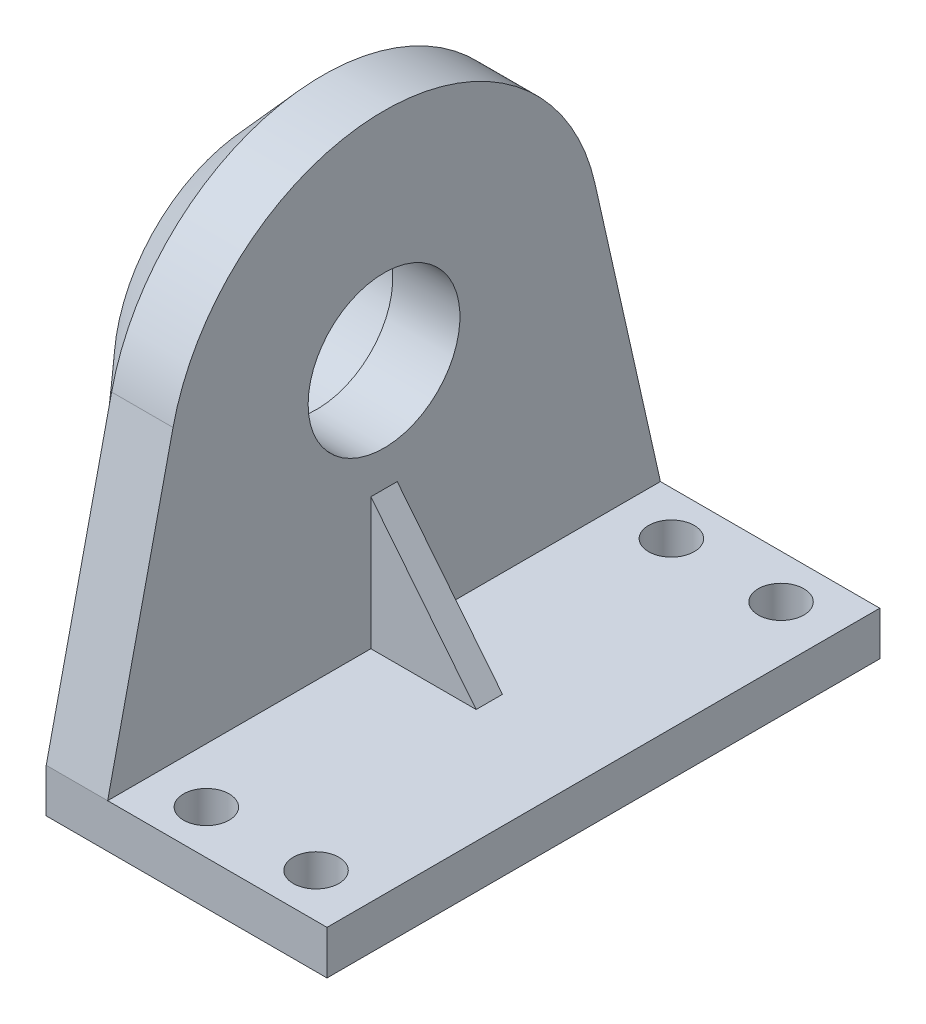
ISO-10303-21;
HEADER;
FILE_DESCRIPTION(('STEP AP214'),'2;1');
FILE_NAME('part.step','',(''),(''),'','','');
FILE_SCHEMA(('AUTOMOTIVE_DESIGN { 1 0 10303 214 1 1 1 1 }'));
ENDSEC;
DATA;
#1=APPLICATION_CONTEXT('core data for automotive mechanical design processes');
#2=APPLICATION_PROTOCOL_DEFINITION('international standard','automotive_design',2000,#1);
#3=PRODUCT_CONTEXT('',#1,'mechanical');
#4=PRODUCT('Part','Part','',(#3));
#5=PRODUCT_RELATED_PRODUCT_CATEGORY('part','',(#4));
#6=PRODUCT_DEFINITION_FORMATION('','',#4);
#7=PRODUCT_DEFINITION_CONTEXT('part definition',#1,'design');
#8=PRODUCT_DEFINITION('design','',#6,#7);
#9=PRODUCT_DEFINITION_SHAPE('','',#8);
#10=(LENGTH_UNIT() NAMED_UNIT(*) SI_UNIT(.MILLI.,.METRE.));
#11=(NAMED_UNIT(*) PLANE_ANGLE_UNIT() SI_UNIT($,.RADIAN.));
#12=(NAMED_UNIT(*) SI_UNIT($,.STERADIAN.) SOLID_ANGLE_UNIT());
#13=UNCERTAINTY_MEASURE_WITH_UNIT(LENGTH_MEASURE(1.E-05),#10,'distance_accuracy_value','');
#14=(GEOMETRIC_REPRESENTATION_CONTEXT(3) GLOBAL_UNCERTAINTY_ASSIGNED_CONTEXT((#13)) GLOBAL_UNIT_ASSIGNED_CONTEXT((#10,
#11,#12)) REPRESENTATION_CONTEXT('',''));
#15=CARTESIAN_POINT('',(0.,0.,0.));
#16=DIRECTION('',(0.,0.,1.));
#17=DIRECTION('',(1.,0.,0.));
#18=AXIS2_PLACEMENT_3D('',#15,#16,#17);
#19=CARTESIAN_POINT('',(14.6534343765315,24.65,0.));
#20=DIRECTION('',(-1.,0.,0.));
#21=DIRECTION('',(0.,0.,1.));
#22=AXIS2_PLACEMENT_3D('',#19,#20,#21);
#23=PLANE('',#22);
#24=CARTESIAN_POINT('',(14.6534343765315,0.,0.));
#25=DIRECTION('',(-1.,0.,0.));
#26=DIRECTION('',(0.,0.,1.));
#27=AXIS2_PLACEMENT_3D('',#24,#25,#26);
#28=CIRCLE('',#27,8.65);
#29=CARTESIAN_POINT('',(14.6534343765315,0.,8.65));
#30=VERTEX_POINT('',#29);
#31=EDGE_CURVE('E272',#30,#30,#28,.T.);
#32=ORIENTED_EDGE('',*,*,#31,.T.);
#33=EDGE_LOOP('',(#32));
#34=FACE_BOUND('',#33,.T.);
#35=DIRECTION('',(0.,-1.,0.));
#36=VECTOR('',#35,1.);
#37=CARTESIAN_POINT('',(14.6534343765316,-27.7,1.5));
#38=LINE('',#37,#36);
#39=CARTESIAN_POINT('',(14.6534343765316,-12.7,1.5));
#40=VERTEX_POINT('',#39);
#41=CARTESIAN_POINT('',(14.6534343765316,-27.7,1.5));
#42=VERTEX_POINT('',#41);
#43=EDGE_CURVE('E130',#40,#42,#38,.T.);
#44=ORIENTED_EDGE('',*,*,#43,.F.);
#45=DIRECTION('',(0.,0.,-1.));
#46=VECTOR('',#45,1.);
#47=CARTESIAN_POINT('',(14.6534343765316,-12.7,1.5));
#48=LINE('',#47,#46);
#49=CARTESIAN_POINT('',(14.6534343765316,-12.7,-1.5));
#50=VERTEX_POINT('',#49);
#51=EDGE_CURVE('E126',#40,#50,#48,.T.);
#52=ORIENTED_EDGE('',*,*,#51,.T.);
#53=DIRECTION('',(0.,-1.,0.));
#54=VECTOR('',#53,1.);
#55=CARTESIAN_POINT('',(14.6534343765316,-27.7,-1.5));
#56=LINE('',#55,#54);
#57=CARTESIAN_POINT('',(14.6534343765316,-27.7,-1.5));
#58=VERTEX_POINT('',#57);
#59=EDGE_CURVE('E138',#50,#58,#56,.T.);
#60=ORIENTED_EDGE('',*,*,#59,.T.);
#61=DIRECTION('',(0.,0.,1.));
#62=VECTOR('',#61,1.);
#63=CARTESIAN_POINT('',(14.6534343765315,-27.7,-31.5));
#64=LINE('',#63,#62);
#65=CARTESIAN_POINT('',(14.6534343765315,-27.7,-31.5));
#66=VERTEX_POINT('',#65);
#67=EDGE_CURVE('E188',#66,#58,#64,.T.);
#68=ORIENTED_EDGE('',*,*,#67,.F.);
#69=DIRECTION('',(0.,0.975601867960363,0.219547250568643));
#70=VECTOR('',#69,1.);
#71=CARTESIAN_POINT('',(14.6534343765315,-27.7,-31.5));
#72=LINE('',#71,#70);
#73=CARTESIAN_POINT('',(14.6534343765315,5.41183972651707,-24.048586045223));
#74=VERTEX_POINT('',#73);
#75=EDGE_CURVE('E214',#66,#74,#72,.T.);
#76=ORIENTED_EDGE('',*,*,#75,.T.);
#77=CARTESIAN_POINT('',(14.6534343765315,0.,0.));
#78=DIRECTION('',(-1.,0.,0.));
#79=DIRECTION('',(0.,0.,1.));
#80=AXIS2_PLACEMENT_3D('',#77,#78,#79);
#81=CIRCLE('',#80,24.65);
#82=CARTESIAN_POINT('',(14.6534343765315,5.41183972651706,24.048586045223));
#83=VERTEX_POINT('',#82);
#84=EDGE_CURVE('E268',#83,#74,#81,.T.);
#85=ORIENTED_EDGE('',*,*,#84,.F.);
#86=DIRECTION('',(0.,-0.975601867960363,0.219547250568643));
#87=VECTOR('',#86,1.);
#88=CARTESIAN_POINT('',(14.6534343765315,-27.7,31.5));
#89=LINE('',#88,#87);
#90=CARTESIAN_POINT('',(14.6534343765315,-27.7,31.5));
#91=VERTEX_POINT('',#90);
#92=EDGE_CURVE('E209',#83,#91,#89,.T.);
#93=ORIENTED_EDGE('',*,*,#92,.T.);
#94=EDGE_CURVE('E179',#42,#91,#64,.T.);
#95=ORIENTED_EDGE('',*,*,#94,.F.);
#96=EDGE_LOOP('',(#44,#52,#60,#68,#76,#85,#93,#95));
#97=FACE_BOUND('',#96,.T.);
#98=ADVANCED_FACE('F45',(#34,#97),#23,.F.);
#99=CARTESIAN_POINT('',(39.6534343765315,-27.7,-31.5));
#100=DIRECTION('',(0.,-1.,0.));
#101=DIRECTION('',(0.,0.,-1.));
#102=AXIS2_PLACEMENT_3D('',#99,#100,#101);
#103=PLANE('',#102);
#104=CARTESIAN_POINT('',(20.9034343765316,-27.7,-26.5));
#105=DIRECTION('',(0.,1.,0.));
#106=DIRECTION('',(0.,0.,1.));
#107=AXIS2_PLACEMENT_3D('',#104,#105,#106);
#108=CIRCLE('',#107,2.6);
#109=CARTESIAN_POINT('',(20.9034343765316,-27.7,-23.9));
#110=VERTEX_POINT('',#109);
#111=EDGE_CURVE('E159',#110,#110,#108,.T.);
#112=ORIENTED_EDGE('',*,*,#111,.F.);
#113=EDGE_LOOP('',(#112));
#114=FACE_BOUND('',#113,.T.);
#115=CARTESIAN_POINT('',(33.4034343765315,-27.7,-26.5));
#116=DIRECTION('',(0.,1.,0.));
#117=DIRECTION('',(0.,0.,1.));
#118=AXIS2_PLACEMENT_3D('',#115,#116,#117);
#119=CIRCLE('',#118,2.6);
#120=CARTESIAN_POINT('',(33.4034343765315,-27.7,-23.9));
#121=VERTEX_POINT('',#120);
#122=EDGE_CURVE('E155',#121,#121,#119,.T.);
#123=ORIENTED_EDGE('',*,*,#122,.F.);
#124=EDGE_LOOP('',(#123));
#125=FACE_BOUND('',#124,.T.);
#126=CARTESIAN_POINT('',(33.4034343765315,-27.7,26.5));
#127=DIRECTION('',(0.,1.,0.));
#128=DIRECTION('',(0.,0.,1.));
#129=AXIS2_PLACEMENT_3D('',#126,#127,#128);
#130=CIRCLE('',#129,2.6);
#131=CARTESIAN_POINT('',(33.4034343765315,-27.7,29.1));
#132=VERTEX_POINT('',#131);
#133=EDGE_CURVE('E164',#132,#132,#130,.T.);
#134=ORIENTED_EDGE('',*,*,#133,.F.);
#135=EDGE_LOOP('',(#134));
#136=FACE_BOUND('',#135,.T.);
#137=CARTESIAN_POINT('',(20.9034343765316,-27.7,26.5));
#138=DIRECTION('',(0.,1.,0.));
#139=DIRECTION('',(0.,0.,1.));
#140=AXIS2_PLACEMENT_3D('',#137,#138,#139);
#141=CIRCLE('',#140,2.6);
#142=CARTESIAN_POINT('',(20.9034343765316,-27.7,29.1));
#143=VERTEX_POINT('',#142);
#144=EDGE_CURVE('E150',#143,#143,#141,.T.);
#145=ORIENTED_EDGE('',*,*,#144,.F.);
#146=EDGE_LOOP('',(#145));
#147=FACE_BOUND('',#146,.T.);
#148=DIRECTION('',(1.,0.,0.));
#149=VECTOR('',#148,1.);
#150=CARTESIAN_POINT('',(26.6534343765316,-27.7,1.5));
#151=LINE('',#150,#149);
#152=CARTESIAN_POINT('',(26.6534343765316,-27.7,1.5));
#153=VERTEX_POINT('',#152);
#154=EDGE_CURVE('E131',#42,#153,#151,.T.);
#155=ORIENTED_EDGE('',*,*,#154,.F.);
#156=ORIENTED_EDGE('',*,*,#94,.T.);
#157=DIRECTION('',(-1.,0.,0.));
#158=VECTOR('',#157,1.);
#159=CARTESIAN_POINT('',(39.6534343765315,-27.7,31.5));
#160=LINE('',#159,#158);
#161=CARTESIAN_POINT('',(39.6534343765315,-27.7,31.5));
#162=VERTEX_POINT('',#161);
#163=EDGE_CURVE('E199',#162,#91,#160,.T.);
#164=ORIENTED_EDGE('',*,*,#163,.F.);
#165=DIRECTION('',(0.,0.,1.));
#166=VECTOR('',#165,1.);
#167=CARTESIAN_POINT('',(39.6534343765315,-27.7,-31.5));
#168=LINE('',#167,#166);
#169=CARTESIAN_POINT('',(39.6534343765315,-27.7,-31.5));
#170=VERTEX_POINT('',#169);
#171=EDGE_CURVE('E187',#170,#162,#168,.T.);
#172=ORIENTED_EDGE('',*,*,#171,.F.);
#173=DIRECTION('',(-1.,0.,0.));
#174=VECTOR('',#173,1.);
#175=CARTESIAN_POINT('',(39.6534343765315,-27.7,-31.5));
#176=LINE('',#175,#174);
#177=EDGE_CURVE('E205',#170,#66,#176,.T.);
#178=ORIENTED_EDGE('',*,*,#177,.T.);
#179=ORIENTED_EDGE('',*,*,#67,.T.);
#180=DIRECTION('',(1.,0.,0.));
#181=VECTOR('',#180,1.);
#182=CARTESIAN_POINT('',(26.6534343765316,-27.7,-1.5));
#183=LINE('',#182,#181);
#184=CARTESIAN_POINT('',(26.6534343765316,-27.7,-1.5));
#185=VERTEX_POINT('',#184);
#186=EDGE_CURVE('E143',#58,#185,#183,.T.);
#187=ORIENTED_EDGE('',*,*,#186,.T.);
#188=DIRECTION('',(0.,0.,-1.));
#189=VECTOR('',#188,1.);
#190=CARTESIAN_POINT('',(26.6534343765316,-27.7,1.5));
#191=LINE('',#190,#189);
#192=EDGE_CURVE('E61',#153,#185,#191,.T.);
#193=ORIENTED_EDGE('',*,*,#192,.F.);
#194=EDGE_LOOP('',(#155,#156,#164,#172,#178,#179,#187,#193));
#195=FACE_BOUND('',#194,.T.);
#196=ADVANCED_FACE('F141',(#114,#125,#136,#147,#195),#103,.F.);
#197=CARTESIAN_POINT('',(0.,11.15,0.));
#198=DIRECTION('',(1.,0.,0.));
#199=DIRECTION('',(0.,0.,-1.));
#200=AXIS2_PLACEMENT_3D('',#197,#198,#199);
#201=PLANE('',#200);
#202=CARTESIAN_POINT('',(0.,0.,0.));
#203=DIRECTION('',(-1.,0.,0.));
#204=DIRECTION('',(0.,0.,1.));
#205=AXIS2_PLACEMENT_3D('',#202,#203,#204);
#206=CIRCLE('',#205,11.15);
#207=CARTESIAN_POINT('',(0.,0.,11.15));
#208=VERTEX_POINT('',#207);
#209=EDGE_CURVE('E11',#208,#208,#206,.T.);
#210=ORIENTED_EDGE('',*,*,#209,.F.);
#211=EDGE_LOOP('',(#210));
#212=FACE_BOUND('',#211,.T.);
#213=CARTESIAN_POINT('',(0.,0.,0.));
#214=DIRECTION('',(-1.,0.,0.));
#215=DIRECTION('',(0.,0.,1.));
#216=AXIS2_PLACEMENT_3D('',#213,#214,#215);
#217=CIRCLE('',#216,16.15);
#218=CARTESIAN_POINT('',(0.,0.,16.15));
#219=VERTEX_POINT('',#218);
#220=EDGE_CURVE('E243',#219,#219,#217,.T.);
#221=ORIENTED_EDGE('',*,*,#220,.T.);
#222=EDGE_LOOP('',(#221));
#223=FACE_BOUND('',#222,.T.);
#224=ADVANCED_FACE('F47',(#212,#223),#201,.F.);
#225=CARTESIAN_POINT('',(0.,0.,0.));
#226=DIRECTION('',(-1.,0.,0.));
#227=DIRECTION('',(0.,0.,1.));
#228=AXIS2_PLACEMENT_3D('',#225,#226,#227);
#229=CYLINDRICAL_SURFACE('',#228,11.15);
#230=CARTESIAN_POINT('',(7.,0.,0.));
#231=DIRECTION('',(-1.,0.,0.));
#232=DIRECTION('',(0.,0.,1.));
#233=AXIS2_PLACEMENT_3D('',#230,#231,#232);
#234=CIRCLE('',#233,11.15);
#235=CARTESIAN_POINT('',(7.,0.,11.15));
#236=VERTEX_POINT('',#235);
#237=EDGE_CURVE('E54',#236,#236,#234,.T.);
#238=ORIENTED_EDGE('',*,*,#237,.F.);
#239=EDGE_LOOP('',(#238));
#240=FACE_BOUND('',#239,.T.);
#241=ORIENTED_EDGE('',*,*,#209,.T.);
#242=EDGE_LOOP('',(#241));
#243=FACE_BOUND('',#242,.T.);
#244=ADVANCED_FACE('F285',(#240,#243),#229,.F.);
#245=CARTESIAN_POINT('',(7.,11.15,0.));
#246=DIRECTION('',(1.,0.,0.));
#247=DIRECTION('',(0.,0.,-1.));
#248=AXIS2_PLACEMENT_3D('',#245,#246,#247);
#249=PLANE('',#248);
#250=CARTESIAN_POINT('',(7.,0.,0.));
#251=DIRECTION('',(-1.,0.,0.));
#252=DIRECTION('',(0.,0.,1.));
#253=AXIS2_PLACEMENT_3D('',#250,#251,#252);
#254=CIRCLE('',#253,8.65);
#255=CARTESIAN_POINT('',(7.,0.,8.65));
#256=VERTEX_POINT('',#255);
#257=EDGE_CURVE('E276',#256,#256,#254,.T.);
#258=ORIENTED_EDGE('',*,*,#257,.F.);
#259=EDGE_LOOP('',(#258));
#260=FACE_BOUND('',#259,.T.);
#261=ORIENTED_EDGE('',*,*,#237,.T.);
#262=EDGE_LOOP('',(#261));
#263=FACE_BOUND('',#262,.T.);
#264=ADVANCED_FACE('F283',(#260,#263),#249,.F.);
#265=CARTESIAN_POINT('',(0.,0.,0.));
#266=DIRECTION('',(-1.,0.,0.));
#267=DIRECTION('',(0.,0.,1.));
#268=AXIS2_PLACEMENT_3D('',#265,#266,#267);
#269=CYLINDRICAL_SURFACE('',#268,8.65);
#270=ORIENTED_EDGE('',*,*,#31,.F.);
#271=EDGE_LOOP('',(#270));
#272=FACE_BOUND('',#271,.T.);
#273=ORIENTED_EDGE('',*,*,#257,.T.);
#274=EDGE_LOOP('',(#273));
#275=FACE_BOUND('',#274,.T.);
#276=ADVANCED_FACE('F342',(#272,#275),#269,.F.);
#277=CARTESIAN_POINT('',(0.,0.,0.));
#278=DIRECTION('',(-1.,0.,0.));
#279=DIRECTION('',(0.,0.,1.));
#280=AXIS2_PLACEMENT_3D('',#277,#278,#279);
#281=CYLINDRICAL_SURFACE('',#280,24.65);
#282=ORIENTED_EDGE('',*,*,#84,.T.);
#283=DIRECTION('',(1.,0.,0.));
#284=VECTOR('',#283,1.);
#285=CARTESIAN_POINT('',(7.65343437653155,5.41183972651707,-24.048586045223));
#286=LINE('',#285,#284);
#287=CARTESIAN_POINT('',(7.65343437653155,5.41183972651707,-24.048586045223));
#288=VERTEX_POINT('',#287);
#289=EDGE_CURVE('E240',#288,#74,#286,.T.);
#290=ORIENTED_EDGE('',*,*,#289,.F.);
#291=CARTESIAN_POINT('',(7.65343437653155,0.,0.));
#292=DIRECTION('',(-1.,0.,0.));
#293=DIRECTION('',(0.,0.,1.));
#294=AXIS2_PLACEMENT_3D('',#291,#292,#293);
#295=CIRCLE('',#294,24.65);
#296=CARTESIAN_POINT('',(7.65343437653155,5.41183972651706,24.0485860452229));
#297=VERTEX_POINT('',#296);
#298=EDGE_CURVE('E264',#297,#288,#295,.T.);
#299=ORIENTED_EDGE('',*,*,#298,.F.);
#300=DIRECTION('',(1.,0.,0.));
#301=VECTOR('',#300,1.);
#302=CARTESIAN_POINT('',(7.65343437653155,5.41183972651706,24.048586045223));
#303=LINE('',#302,#301);
#304=EDGE_CURVE('E233',#297,#83,#303,.T.);
#305=ORIENTED_EDGE('',*,*,#304,.T.);
#306=EDGE_LOOP('',(#282,#290,#299,#305));
#307=FACE_BOUND('',#306,.T.);
#308=ADVANCED_FACE('F298',(#307),#281,.T.);
#309=CARTESIAN_POINT('',(7.65343437653155,0.,0.));
#310=DIRECTION('',(1.,0.,0.));
#311=DIRECTION('',(0.,0.,-1.));
#312=AXIS2_PLACEMENT_3D('',#309,#310,#311);
#313=CONICAL_SURFACE('',#312,24.65,0.837758040957284);
#314=ORIENTED_EDGE('',*,*,#220,.F.);
#315=EDGE_LOOP('',(#314));
#316=FACE_BOUND('',#315,.T.);
#317=ORIENTED_EDGE('',*,*,#298,.T.);
#318=CARTESIAN_POINT('',(7.65343437653155,0.,0.));
#319=DIRECTION('',(-1.,0.,0.));
#320=DIRECTION('',(0.,0.,-1.));
#321=AXIS2_PLACEMENT_3D('',#318,#319,#320);
#322=CIRCLE('',#321,24.65);
#323=EDGE_CURVE('E210',#288,#297,#322,.T.);
#324=ORIENTED_EDGE('',*,*,#323,.T.);
#325=EDGE_LOOP('',(#317,#324));
#326=FACE_BOUND('',#325,.T.);
#327=ADVANCED_FACE('F294',(#316,#326),#313,.T.);
#328=CARTESIAN_POINT('',(7.65343437653155,-27.7,-31.5));
#329=DIRECTION('',(0.,0.219547250568643,-0.975601867960363));
#330=DIRECTION('',(0.,0.975601867960363,0.219547250568643));
#331=AXIS2_PLACEMENT_3D('',#328,#329,#330);
#332=PLANE('',#331);
#333=ORIENTED_EDGE('',*,*,#75,.F.);
#334=DIRECTION('',(1.,0.,0.));
#335=VECTOR('',#334,1.);
#336=CARTESIAN_POINT('',(7.65343437653155,-27.7,-31.5));
#337=LINE('',#336,#335);
#338=CARTESIAN_POINT('',(7.65343437653155,-27.7,-31.5));
#339=VERTEX_POINT('',#338);
#340=EDGE_CURVE('E244',#339,#66,#337,.T.);
#341=ORIENTED_EDGE('',*,*,#340,.F.);
#342=DIRECTION('',(0.,0.975601867960363,0.219547250568643));
#343=VECTOR('',#342,1.);
#344=CARTESIAN_POINT('',(7.65343437653155,-27.7,-31.5));
#345=LINE('',#344,#343);
#346=EDGE_CURVE('E229',#339,#288,#345,.T.);
#347=ORIENTED_EDGE('',*,*,#346,.T.);
#348=ORIENTED_EDGE('',*,*,#289,.T.);
#349=EDGE_LOOP('',(#333,#341,#347,#348));
#350=FACE_BOUND('',#349,.T.);
#351=ADVANCED_FACE('F297',(#350),#332,.T.);
#352=CARTESIAN_POINT('',(7.65343437653155,-32.7,-31.5));
#353=DIRECTION('',(0.,0.,-1.));
#354=DIRECTION('',(0.,1.,0.));
#355=AXIS2_PLACEMENT_3D('',#352,#353,#354);
#356=PLANE('',#355);
#357=ORIENTED_EDGE('',*,*,#340,.T.);
#358=ORIENTED_EDGE('',*,*,#177,.F.);
#359=DIRECTION('',(0.,1.,0.));
#360=VECTOR('',#359,1.);
#361=CARTESIAN_POINT('',(39.6534343765315,-32.7,-31.5));
#362=LINE('',#361,#360);
#363=CARTESIAN_POINT('',(39.6534343765315,-32.7,-31.5));
#364=VERTEX_POINT('',#363);
#365=EDGE_CURVE('E183',#364,#170,#362,.T.);
#366=ORIENTED_EDGE('',*,*,#365,.F.);
#367=DIRECTION('',(1.,0.,0.));
#368=VECTOR('',#367,1.);
#369=CARTESIAN_POINT('',(7.65343437653155,-32.7,-31.5));
#370=LINE('',#369,#368);
#371=CARTESIAN_POINT('',(7.65343437653155,-32.7,-31.5));
#372=VERTEX_POINT('',#371);
#373=EDGE_CURVE('E248',#372,#364,#370,.T.);
#374=ORIENTED_EDGE('',*,*,#373,.F.);
#375=DIRECTION('',(0.,1.,0.));
#376=VECTOR('',#375,1.);
#377=CARTESIAN_POINT('',(7.65343437653155,-32.7,-31.5));
#378=LINE('',#377,#376);
#379=EDGE_CURVE('E225',#372,#339,#378,.T.);
#380=ORIENTED_EDGE('',*,*,#379,.T.);
#381=EDGE_LOOP('',(#357,#358,#366,#374,#380));
#382=FACE_BOUND('',#381,.T.);
#383=ADVANCED_FACE('F312',(#382),#356,.T.);
#384=CARTESIAN_POINT('',(7.65343437653155,-32.7,31.5));
#385=DIRECTION('',(0.,-1.,0.));
#386=DIRECTION('',(0.,0.,-1.));
#387=AXIS2_PLACEMENT_3D('',#384,#385,#386);
#388=PLANE('',#387);
#389=CARTESIAN_POINT('',(20.9034343765316,-32.7,26.5));
#390=DIRECTION('',(0.,1.,0.));
#391=DIRECTION('',(0.,0.,1.));
#392=AXIS2_PLACEMENT_3D('',#389,#390,#391);
#393=CIRCLE('',#392,2.6);
#394=CARTESIAN_POINT('',(20.9034343765316,-32.7,29.1));
#395=VERTEX_POINT('',#394);
#396=EDGE_CURVE('E145',#395,#395,#393,.T.);
#397=ORIENTED_EDGE('',*,*,#396,.T.);
#398=EDGE_LOOP('',(#397));
#399=FACE_BOUND('',#398,.T.);
#400=CARTESIAN_POINT('',(33.4034343765315,-32.7,26.5));
#401=DIRECTION('',(0.,1.,0.));
#402=DIRECTION('',(0.,0.,1.));
#403=AXIS2_PLACEMENT_3D('',#400,#401,#402);
#404=CIRCLE('',#403,2.6);
#405=CARTESIAN_POINT('',(33.4034343765315,-32.7,29.1));
#406=VERTEX_POINT('',#405);
#407=EDGE_CURVE('E168',#406,#406,#404,.T.);
#408=ORIENTED_EDGE('',*,*,#407,.T.);
#409=EDGE_LOOP('',(#408));
#410=FACE_BOUND('',#409,.T.);
#411=CARTESIAN_POINT('',(33.4034343765315,-32.7,-26.5));
#412=DIRECTION('',(0.,1.,0.));
#413=DIRECTION('',(0.,0.,1.));
#414=AXIS2_PLACEMENT_3D('',#411,#412,#413);
#415=CIRCLE('',#414,2.6);
#416=CARTESIAN_POINT('',(33.4034343765315,-32.7,-23.9));
#417=VERTEX_POINT('',#416);
#418=EDGE_CURVE('E160',#417,#417,#415,.T.);
#419=ORIENTED_EDGE('',*,*,#418,.T.);
#420=EDGE_LOOP('',(#419));
#421=FACE_BOUND('',#420,.T.);
#422=CARTESIAN_POINT('',(20.9034343765316,-32.7,-26.5));
#423=DIRECTION('',(0.,1.,0.));
#424=DIRECTION('',(0.,0.,1.));
#425=AXIS2_PLACEMENT_3D('',#422,#423,#424);
#426=CIRCLE('',#425,2.6);
#427=CARTESIAN_POINT('',(20.9034343765316,-32.7,-23.9));
#428=VERTEX_POINT('',#427);
#429=EDGE_CURVE('E175',#428,#428,#426,.T.);
#430=ORIENTED_EDGE('',*,*,#429,.T.);
#431=EDGE_LOOP('',(#430));
#432=FACE_BOUND('',#431,.T.);
#433=ORIENTED_EDGE('',*,*,#373,.T.);
#434=DIRECTION('',(0.,0.,-1.));
#435=VECTOR('',#434,1.);
#436=CARTESIAN_POINT('',(39.6534343765315,-32.7,-31.5));
#437=LINE('',#436,#435);
#438=CARTESIAN_POINT('',(39.6534343765315,-32.7,31.5));
#439=VERTEX_POINT('',#438);
#440=EDGE_CURVE('E195',#439,#364,#437,.T.);
#441=ORIENTED_EDGE('',*,*,#440,.F.);
#442=DIRECTION('',(1.,0.,0.));
#443=VECTOR('',#442,1.);
#444=CARTESIAN_POINT('',(7.65343437653155,-32.7,31.5));
#445=LINE('',#444,#443);
#446=CARTESIAN_POINT('',(7.65343437653155,-32.7,31.5));
#447=VERTEX_POINT('',#446);
#448=EDGE_CURVE('E251',#447,#439,#445,.T.);
#449=ORIENTED_EDGE('',*,*,#448,.F.);
#450=DIRECTION('',(0.,0.,-1.));
#451=VECTOR('',#450,1.);
#452=CARTESIAN_POINT('',(7.65343437653155,-32.7,31.5));
#453=LINE('',#452,#451);
#454=EDGE_CURVE('E221',#447,#372,#453,.T.);
#455=ORIENTED_EDGE('',*,*,#454,.T.);
#456=EDGE_LOOP('',(#433,#441,#449,#455));
#457=FACE_BOUND('',#456,.T.);
#458=ADVANCED_FACE('F379',(#399,#410,#421,#432,#457),#388,.T.);
#459=CARTESIAN_POINT('',(7.65343437653155,-32.7,31.5));
#460=DIRECTION('',(0.,0.,1.));
#461=DIRECTION('',(1.,0.,0.));
#462=AXIS2_PLACEMENT_3D('',#459,#460,#461);
#463=PLANE('',#462);
#464=ORIENTED_EDGE('',*,*,#448,.T.);
#465=DIRECTION('',(0.,-1.,0.));
#466=VECTOR('',#465,1.);
#467=CARTESIAN_POINT('',(39.6534343765315,-32.7,31.5));
#468=LINE('',#467,#466);
#469=EDGE_CURVE('E191',#162,#439,#468,.T.);
#470=ORIENTED_EDGE('',*,*,#469,.F.);
#471=ORIENTED_EDGE('',*,*,#163,.T.);
#472=DIRECTION('',(1.,0.,0.));
#473=VECTOR('',#472,1.);
#474=CARTESIAN_POINT('',(7.65343437653155,-27.7,31.5));
#475=LINE('',#474,#473);
#476=CARTESIAN_POINT('',(7.65343437653155,-27.7,31.5));
#477=VERTEX_POINT('',#476);
#478=EDGE_CURVE('E254',#477,#91,#475,.T.);
#479=ORIENTED_EDGE('',*,*,#478,.F.);
#480=DIRECTION('',(0.,-1.,0.));
#481=VECTOR('',#480,1.);
#482=CARTESIAN_POINT('',(7.65343437653155,-32.7,31.5));
#483=LINE('',#482,#481);
#484=EDGE_CURVE('E217',#477,#447,#483,.T.);
#485=ORIENTED_EDGE('',*,*,#484,.T.);
#486=EDGE_LOOP('',(#464,#470,#471,#479,#485));
#487=FACE_BOUND('',#486,.T.);
#488=ADVANCED_FACE('F328',(#487),#463,.T.);
#489=CARTESIAN_POINT('',(7.65343437653155,-27.7,31.5));
#490=DIRECTION('',(0.,0.219547250568643,0.975601867960363));
#491=DIRECTION('',(0.,-0.975601867960363,0.219547250568643));
#492=AXIS2_PLACEMENT_3D('',#489,#490,#491);
#493=PLANE('',#492);
#494=ORIENTED_EDGE('',*,*,#92,.F.);
#495=ORIENTED_EDGE('',*,*,#304,.F.);
#496=DIRECTION('',(0.,-0.975601867960363,0.219547250568643));
#497=VECTOR('',#496,1.);
#498=CARTESIAN_POINT('',(7.65343437653155,-27.7,31.5));
#499=LINE('',#498,#497);
#500=EDGE_CURVE('E69',#297,#477,#499,.T.);
#501=ORIENTED_EDGE('',*,*,#500,.T.);
#502=ORIENTED_EDGE('',*,*,#478,.T.);
#503=EDGE_LOOP('',(#494,#495,#501,#502));
#504=FACE_BOUND('',#503,.T.);
#505=ADVANCED_FACE('F319',(#504),#493,.T.);
#506=CARTESIAN_POINT('',(7.65343437653155,0.,0.));
#507=DIRECTION('',(1.,0.,0.));
#508=DIRECTION('',(0.,0.,-1.));
#509=AXIS2_PLACEMENT_3D('',#506,#507,#508);
#510=PLANE('',#509);
#511=ORIENTED_EDGE('',*,*,#323,.F.);
#512=ORIENTED_EDGE('',*,*,#346,.F.);
#513=ORIENTED_EDGE('',*,*,#379,.F.);
#514=ORIENTED_EDGE('',*,*,#454,.F.);
#515=ORIENTED_EDGE('',*,*,#484,.F.);
#516=ORIENTED_EDGE('',*,*,#500,.F.);
#517=EDGE_LOOP('',(#511,#512,#513,#514,#515,#516));
#518=FACE_BOUND('',#517,.T.);
#519=ADVANCED_FACE('F316',(#518),#510,.F.);
#520=CARTESIAN_POINT('',(39.6534343765315,0.,0.));
#521=DIRECTION('',(1.,0.,0.));
#522=DIRECTION('',(0.,0.,-1.));
#523=AXIS2_PLACEMENT_3D('',#520,#521,#522);
#524=PLANE('',#523);
#525=ORIENTED_EDGE('',*,*,#365,.T.);
#526=ORIENTED_EDGE('',*,*,#171,.T.);
#527=ORIENTED_EDGE('',*,*,#469,.T.);
#528=ORIENTED_EDGE('',*,*,#440,.T.);
#529=EDGE_LOOP('',(#525,#526,#527,#528));
#530=FACE_BOUND('',#529,.T.);
#531=ADVANCED_FACE('F318',(#530),#524,.T.);
#532=CARTESIAN_POINT('',(20.9034343765316,-32.7,-26.5));
#533=DIRECTION('',(0.,1.,0.));
#534=DIRECTION('',(0.,0.,1.));
#535=AXIS2_PLACEMENT_3D('',#532,#533,#534);
#536=CYLINDRICAL_SURFACE('',#535,2.6);
#537=ORIENTED_EDGE('',*,*,#429,.F.);
#538=EDGE_LOOP('',(#537));
#539=FACE_BOUND('',#538,.T.);
#540=ORIENTED_EDGE('',*,*,#111,.T.);
#541=EDGE_LOOP('',(#540));
#542=FACE_BOUND('',#541,.T.);
#543=ADVANCED_FACE('F325',(#539,#542),#536,.F.);
#544=CARTESIAN_POINT('',(33.4034343765315,-32.7,-26.5));
#545=DIRECTION('',(0.,1.,0.));
#546=DIRECTION('',(0.,0.,1.));
#547=AXIS2_PLACEMENT_3D('',#544,#545,#546);
#548=CYLINDRICAL_SURFACE('',#547,2.6);
#549=ORIENTED_EDGE('',*,*,#418,.F.);
#550=EDGE_LOOP('',(#549));
#551=FACE_BOUND('',#550,.T.);
#552=ORIENTED_EDGE('',*,*,#122,.T.);
#553=EDGE_LOOP('',(#552));
#554=FACE_BOUND('',#553,.T.);
#555=ADVANCED_FACE('F440',(#551,#554),#548,.F.);
#556=CARTESIAN_POINT('',(33.4034343765315,-32.7,26.5));
#557=DIRECTION('',(0.,1.,0.));
#558=DIRECTION('',(0.,0.,1.));
#559=AXIS2_PLACEMENT_3D('',#556,#557,#558);
#560=CYLINDRICAL_SURFACE('',#559,2.6);
#561=ORIENTED_EDGE('',*,*,#407,.F.);
#562=EDGE_LOOP('',(#561));
#563=FACE_BOUND('',#562,.T.);
#564=ORIENTED_EDGE('',*,*,#133,.T.);
#565=EDGE_LOOP('',(#564));
#566=FACE_BOUND('',#565,.T.);
#567=ADVANCED_FACE('F451',(#563,#566),#560,.F.);
#568=CARTESIAN_POINT('',(20.9034343765316,-32.7,26.5));
#569=DIRECTION('',(0.,1.,0.));
#570=DIRECTION('',(0.,0.,1.));
#571=AXIS2_PLACEMENT_3D('',#568,#569,#570);
#572=CYLINDRICAL_SURFACE('',#571,2.6);
#573=ORIENTED_EDGE('',*,*,#396,.F.);
#574=EDGE_LOOP('',(#573));
#575=FACE_BOUND('',#574,.T.);
#576=ORIENTED_EDGE('',*,*,#144,.T.);
#577=EDGE_LOOP('',(#576));
#578=FACE_BOUND('',#577,.T.);
#579=ADVANCED_FACE('F462',(#575,#578),#572,.F.);
#580=CARTESIAN_POINT('',(26.6534343765316,-27.7,1.5));
#581=DIRECTION('',(-0.78086880944303,-0.624695047554424,0.));
#582=DIRECTION('',(0.624695047554424,-0.78086880944303,0.));
#583=AXIS2_PLACEMENT_3D('',#580,#581,#582);
#584=PLANE('',#583);
#585=DIRECTION('',(-0.624695047554424,0.78086880944303,0.));
#586=VECTOR('',#585,1.);
#587=CARTESIAN_POINT('',(26.6534343765316,-27.7,-1.5));
#588=LINE('',#587,#586);
#589=EDGE_CURVE('E528',#185,#50,#588,.T.);
#590=ORIENTED_EDGE('',*,*,#589,.T.);
#591=ORIENTED_EDGE('',*,*,#51,.F.);
#592=DIRECTION('',(-0.624695047554424,0.78086880944303,0.));
#593=VECTOR('',#592,1.);
#594=CARTESIAN_POINT('',(26.6534343765316,-27.7,1.5));
#595=LINE('',#594,#593);
#596=EDGE_CURVE('E122',#153,#40,#595,.T.);
#597=ORIENTED_EDGE('',*,*,#596,.F.);
#598=ORIENTED_EDGE('',*,*,#192,.T.);
#599=EDGE_LOOP('',(#590,#591,#597,#598));
#600=FACE_BOUND('',#599,.T.);
#601=ADVANCED_FACE('F124',(#600),#584,.F.);
#602=CARTESIAN_POINT('',(0.,0.,1.5));
#603=DIRECTION('',(0.,0.,-1.));
#604=DIRECTION('',(-1.,0.,0.));
#605=AXIS2_PLACEMENT_3D('',#602,#603,#604);
#606=PLANE('',#605);
#607=ORIENTED_EDGE('',*,*,#154,.T.);
#608=ORIENTED_EDGE('',*,*,#596,.T.);
#609=ORIENTED_EDGE('',*,*,#43,.T.);
#610=EDGE_LOOP('',(#607,#608,#609));
#611=FACE_BOUND('',#610,.T.);
#612=ADVANCED_FACE('F134',(#611),#606,.F.);
#613=CARTESIAN_POINT('',(0.,0.,-1.5));
#614=DIRECTION('',(0.,0.,-1.));
#615=DIRECTION('',(-1.,0.,0.));
#616=AXIS2_PLACEMENT_3D('',#613,#614,#615);
#617=PLANE('',#616);
#618=ORIENTED_EDGE('',*,*,#186,.F.);
#619=ORIENTED_EDGE('',*,*,#59,.F.);
#620=ORIENTED_EDGE('',*,*,#589,.F.);
#621=EDGE_LOOP('',(#618,#619,#620));
#622=FACE_BOUND('',#621,.T.);
#623=ADVANCED_FACE('F507',(#622),#617,.T.);
#624=CLOSED_SHELL('',(#98,#196,#224,#244,#264,#276,#308,#327,#351,#383,#458,#488,#505,#519,#531,
#543,#555,#567,#579,#601,#612,#623));
#625=MANIFOLD_SOLID_BREP('B2',#624);
#626=ADVANCED_BREP_SHAPE_REPRESENTATION('',(#18,#625),#14);
#627=SHAPE_DEFINITION_REPRESENTATION(#9,#626);
ENDSEC;
END-ISO-10303-21;
